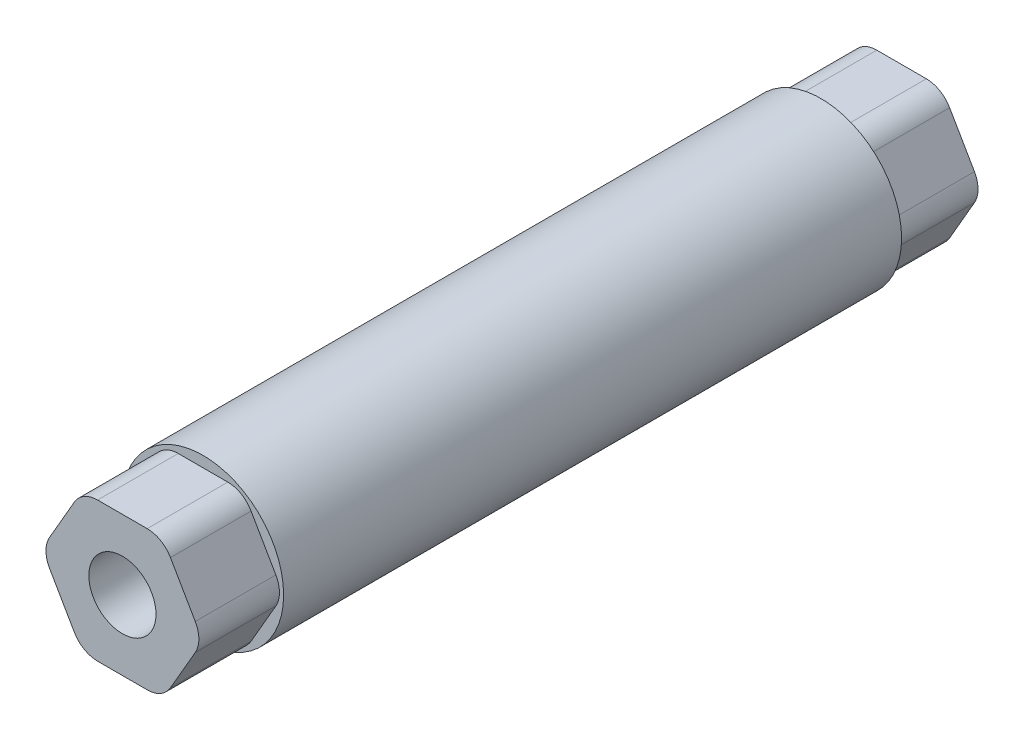
ISO-10303-21;
HEADER;
FILE_DESCRIPTION(('STEP AP214'),'2;1');
FILE_NAME('part.step','',(''),(''),'','','');
FILE_SCHEMA(('AUTOMOTIVE_DESIGN { 1 0 10303 214 1 1 1 1 }'));
ENDSEC;
DATA;
#1=APPLICATION_CONTEXT('core data for automotive mechanical design processes');
#2=APPLICATION_PROTOCOL_DEFINITION('international standard','automotive_design',2000,#1);
#3=PRODUCT_CONTEXT('',#1,'mechanical');
#4=PRODUCT('Part','Part','',(#3));
#5=PRODUCT_RELATED_PRODUCT_CATEGORY('part','',(#4));
#6=PRODUCT_DEFINITION_FORMATION('','',#4);
#7=PRODUCT_DEFINITION_CONTEXT('part definition',#1,'design');
#8=PRODUCT_DEFINITION('design','',#6,#7);
#9=PRODUCT_DEFINITION_SHAPE('','',#8);
#10=(LENGTH_UNIT() NAMED_UNIT(*) SI_UNIT(.MILLI.,.METRE.));
#11=(NAMED_UNIT(*) PLANE_ANGLE_UNIT() SI_UNIT($,.RADIAN.));
#12=(NAMED_UNIT(*) SI_UNIT($,.STERADIAN.) SOLID_ANGLE_UNIT());
#13=UNCERTAINTY_MEASURE_WITH_UNIT(LENGTH_MEASURE(1.E-05),#10,'distance_accuracy_value','');
#14=(GEOMETRIC_REPRESENTATION_CONTEXT(3) GLOBAL_UNCERTAINTY_ASSIGNED_CONTEXT((#13)) GLOBAL_UNIT_ASSIGNED_CONTEXT((#10,
#11,#12)) REPRESENTATION_CONTEXT('',''));
#15=CARTESIAN_POINT('',(0.,0.,0.));
#16=DIRECTION('',(0.,0.,1.));
#17=DIRECTION('',(1.,0.,0.));
#18=AXIS2_PLACEMENT_3D('',#15,#16,#17);
#19=CARTESIAN_POINT('',(0.,0.,29.));
#20=DIRECTION('',(0.,0.,-1.));
#21=DIRECTION('',(-1.,0.,0.));
#22=AXIS2_PLACEMENT_3D('',#19,#20,#21);
#23=CYLINDRICAL_SURFACE('',#22,3.);
#24=CARTESIAN_POINT('',(0.,0.,26.));
#25=DIRECTION('',(0.,0.,1.));
#26=DIRECTION('',(1.,0.,0.));
#27=AXIS2_PLACEMENT_3D('',#24,#25,#26);
#28=CIRCLE('',#27,3.);
#29=CARTESIAN_POINT('',(1.50000000000003,-2.5980762113533,26.));
#30=VERTEX_POINT('',#29);
#31=CARTESIAN_POINT('',(3.,0.,26.));
#32=VERTEX_POINT('',#31);
#33=EDGE_CURVE('E333',#30,#32,#28,.T.);
#34=ORIENTED_EDGE('',*,*,#33,.F.);
#35=CARTESIAN_POINT('',(0.,0.,26.));
#36=DIRECTION('',(0.,0.,1.));
#37=DIRECTION('',(1.,0.,0.));
#38=AXIS2_PLACEMENT_3D('',#35,#36,#37);
#39=CIRCLE('',#38,3.);
#40=CARTESIAN_POINT('',(-1.49999999999998,-2.59807621135333,26.));
#41=VERTEX_POINT('',#40);
#42=EDGE_CURVE('E369',#41,#30,#39,.T.);
#43=ORIENTED_EDGE('',*,*,#42,.F.);
#44=CARTESIAN_POINT('',(0.,0.,26.));
#45=DIRECTION('',(0.,0.,1.));
#46=DIRECTION('',(1.,0.,0.));
#47=AXIS2_PLACEMENT_3D('',#44,#45,#46);
#48=CIRCLE('',#47,3.);
#49=CARTESIAN_POINT('',(-3.,0.,26.));
#50=VERTEX_POINT('',#49);
#51=EDGE_CURVE('E340',#50,#41,#48,.T.);
#52=ORIENTED_EDGE('',*,*,#51,.F.);
#53=CARTESIAN_POINT('',(0.,0.,26.));
#54=DIRECTION('',(0.,0.,1.));
#55=DIRECTION('',(1.,0.,0.));
#56=AXIS2_PLACEMENT_3D('',#53,#54,#55);
#57=CIRCLE('',#56,3.);
#58=CARTESIAN_POINT('',(-1.50000000000001,2.59807621135331,26.));
#59=VERTEX_POINT('',#58);
#60=EDGE_CURVE('E354',#59,#50,#57,.T.);
#61=ORIENTED_EDGE('',*,*,#60,.F.);
#62=CARTESIAN_POINT('',(0.,0.,26.));
#63=DIRECTION('',(0.,0.,1.));
#64=DIRECTION('',(1.,0.,0.));
#65=AXIS2_PLACEMENT_3D('',#62,#63,#64);
#66=CIRCLE('',#65,3.);
#67=CARTESIAN_POINT('',(1.49999999999999,2.59807621135332,26.));
#68=VERTEX_POINT('',#67);
#69=EDGE_CURVE('E347',#68,#59,#66,.T.);
#70=ORIENTED_EDGE('',*,*,#69,.F.);
#71=CARTESIAN_POINT('',(0.,0.,26.));
#72=DIRECTION('',(0.,0.,1.));
#73=DIRECTION('',(1.,0.,0.));
#74=AXIS2_PLACEMENT_3D('',#71,#72,#73);
#75=CIRCLE('',#74,3.);
#76=EDGE_CURVE('E361',#32,#68,#75,.T.);
#77=ORIENTED_EDGE('',*,*,#76,.F.);
#78=EDGE_LOOP('',(#34,#43,#52,#61,#70,#77));
#79=FACE_BOUND('',#78,.T.);
#80=CARTESIAN_POINT('',(0.,0.,3.));
#81=DIRECTION('',(0.,0.,1.));
#82=DIRECTION('',(1.,0.,0.));
#83=AXIS2_PLACEMENT_3D('',#80,#81,#82);
#84=CIRCLE('',#83,3.);
#85=CARTESIAN_POINT('',(1.50000000000003,-2.5980762113533,3.));
#86=VERTEX_POINT('',#85);
#87=CARTESIAN_POINT('',(3.,0.,3.));
#88=VERTEX_POINT('',#87);
#89=EDGE_CURVE('E284',#86,#88,#84,.T.);
#90=ORIENTED_EDGE('',*,*,#89,.T.);
#91=CARTESIAN_POINT('',(0.,0.,3.));
#92=DIRECTION('',(0.,0.,1.));
#93=DIRECTION('',(1.,0.,0.));
#94=AXIS2_PLACEMENT_3D('',#91,#92,#93);
#95=CIRCLE('',#94,3.);
#96=CARTESIAN_POINT('',(1.49999999999999,2.59807621135332,3.));
#97=VERTEX_POINT('',#96);
#98=EDGE_CURVE('E315',#88,#97,#95,.T.);
#99=ORIENTED_EDGE('',*,*,#98,.T.);
#100=CARTESIAN_POINT('',(0.,0.,3.));
#101=DIRECTION('',(0.,0.,1.));
#102=DIRECTION('',(1.,0.,0.));
#103=AXIS2_PLACEMENT_3D('',#100,#101,#102);
#104=CIRCLE('',#103,3.);
#105=CARTESIAN_POINT('',(-1.50000000000001,2.59807621135331,3.));
#106=VERTEX_POINT('',#105);
#107=EDGE_CURVE('E300',#97,#106,#104,.T.);
#108=ORIENTED_EDGE('',*,*,#107,.T.);
#109=CARTESIAN_POINT('',(0.,0.,3.));
#110=DIRECTION('',(0.,0.,1.));
#111=DIRECTION('',(1.,0.,0.));
#112=AXIS2_PLACEMENT_3D('',#109,#110,#111);
#113=CIRCLE('',#112,3.);
#114=CARTESIAN_POINT('',(-3.,0.,3.));
#115=VERTEX_POINT('',#114);
#116=EDGE_CURVE('E308',#106,#115,#113,.T.);
#117=ORIENTED_EDGE('',*,*,#116,.T.);
#118=CARTESIAN_POINT('',(0.,0.,3.));
#119=DIRECTION('',(0.,0.,1.));
#120=DIRECTION('',(1.,0.,0.));
#121=AXIS2_PLACEMENT_3D('',#118,#119,#120);
#122=CIRCLE('',#121,3.);
#123=CARTESIAN_POINT('',(-1.49999999999998,-2.59807621135333,3.));
#124=VERTEX_POINT('',#123);
#125=EDGE_CURVE('E292',#115,#124,#122,.T.);
#126=ORIENTED_EDGE('',*,*,#125,.T.);
#127=CARTESIAN_POINT('',(0.,0.,3.));
#128=DIRECTION('',(0.,0.,1.));
#129=DIRECTION('',(1.,0.,0.));
#130=AXIS2_PLACEMENT_3D('',#127,#128,#129);
#131=CIRCLE('',#130,3.);
#132=EDGE_CURVE('E324',#124,#86,#131,.T.);
#133=ORIENTED_EDGE('',*,*,#132,.T.);
#134=EDGE_LOOP('',(#90,#99,#108,#117,#126,#133));
#135=FACE_BOUND('',#134,.T.);
#136=ADVANCED_FACE('F57',(#79,#135),#23,.T.);
#137=CARTESIAN_POINT('',(0.,0.,29.));
#138=DIRECTION('',(0.,0.,1.));
#139=DIRECTION('',(1.,0.,0.));
#140=AXIS2_PLACEMENT_3D('',#137,#138,#139);
#141=PLANE('',#140);
#142=CARTESIAN_POINT('',(0.,0.,29.));
#143=DIRECTION('',(0.,0.,1.));
#144=DIRECTION('',(1.,0.,0.));
#145=AXIS2_PLACEMENT_3D('',#142,#143,#144);
#146=CIRCLE('',#145,1.25);
#147=CARTESIAN_POINT('',(1.25,0.,29.));
#148=VERTEX_POINT('',#147);
#149=EDGE_CURVE('E269',#148,#148,#146,.T.);
#150=ORIENTED_EDGE('',*,*,#149,.F.);
#151=EDGE_LOOP('',(#150));
#152=FACE_BOUND('',#151,.T.);
#153=DIRECTION('',(0.500000000000007,-0.866025403784435,0.));
#154=VECTOR('',#153,1.);
#155=CARTESIAN_POINT('',(-2.24999999999999,-1.29903810567668,29.));
#156=LINE('',#155,#154);
#157=CARTESIAN_POINT('',(-2.71132486540518,-0.500000000000019,29.));
#158=VERTEX_POINT('',#157);
#159=CARTESIAN_POINT('',(-1.78867513459479,-2.09807621135333,29.));
#160=VERTEX_POINT('',#159);
#161=EDGE_CURVE('E335',#158,#160,#156,.T.);
#162=ORIENTED_EDGE('',*,*,#161,.T.);
#163=CARTESIAN_POINT('',(-0.922649730810359,-1.59807621135332,29.));
#164=DIRECTION('',(0.,0.,1.));
#165=DIRECTION('',(1.,0.,0.));
#166=AXIS2_PLACEMENT_3D('',#163,#164,#165);
#167=CIRCLE('',#166,1.);
#168=CARTESIAN_POINT('',(-0.922649730810349,-2.59807621135332,29.));
#169=VERTEX_POINT('',#168);
#170=EDGE_CURVE('E431',#160,#169,#167,.T.);
#171=ORIENTED_EDGE('',*,*,#170,.T.);
#172=DIRECTION('',(1.,0.,0.));
#173=VECTOR('',#172,1.);
#174=CARTESIAN_POINT('',(0.,-2.59807621135331,29.));
#175=LINE('',#174,#173);
#176=CARTESIAN_POINT('',(0.922649730810408,-2.5980762113533,29.));
#177=VERTEX_POINT('',#176);
#178=EDGE_CURVE('E349',#169,#177,#175,.T.);
#179=ORIENTED_EDGE('',*,*,#178,.T.);
#180=CARTESIAN_POINT('',(0.922649730810398,-1.5980762113533,29.));
#181=DIRECTION('',(0.,0.,1.));
#182=DIRECTION('',(1.,0.,0.));
#183=AXIS2_PLACEMENT_3D('',#180,#181,#182);
#184=CIRCLE('',#183,1.);
#185=CARTESIAN_POINT('',(1.78867513459484,-2.0980762113533,29.));
#186=VERTEX_POINT('',#185);
#187=EDGE_CURVE('E421',#177,#186,#184,.T.);
#188=ORIENTED_EDGE('',*,*,#187,.T.);
#189=DIRECTION('',(0.499999999999995,0.866025403784442,0.));
#190=VECTOR('',#189,1.);
#191=CARTESIAN_POINT('',(2.25000000000002,-1.29903810567665,29.));
#192=LINE('',#191,#190);
#193=CARTESIAN_POINT('',(2.71132486540519,-0.499999999999999,29.));
#194=VERTEX_POINT('',#193);
#195=EDGE_CURVE('E312',#186,#194,#192,.T.);
#196=ORIENTED_EDGE('',*,*,#195,.T.);
#197=CARTESIAN_POINT('',(1.84529946162075,0.,29.));
#198=DIRECTION('',(0.,0.,1.));
#199=DIRECTION('',(1.,0.,0.));
#200=AXIS2_PLACEMENT_3D('',#197,#198,#199);
#201=CIRCLE('',#200,1.);
#202=CARTESIAN_POINT('',(2.71132486540519,0.499999999999997,29.));
#203=VERTEX_POINT('',#202);
#204=EDGE_CURVE('E423',#194,#203,#201,.T.);
#205=ORIENTED_EDGE('',*,*,#204,.T.);
#206=DIRECTION('',(-0.500000000000001,0.866025403784438,0.));
#207=VECTOR('',#206,1.);
#208=CARTESIAN_POINT('',(2.25,1.29903810567666,29.));
#209=LINE('',#208,#207);
#210=CARTESIAN_POINT('',(1.78867513459481,2.09807621135332,29.));
#211=VERTEX_POINT('',#210);
#212=EDGE_CURVE('E364',#203,#211,#209,.T.);
#213=ORIENTED_EDGE('',*,*,#212,.T.);
#214=CARTESIAN_POINT('',(0.92264973081037,1.59807621135332,29.));
#215=DIRECTION('',(0.,0.,1.));
#216=DIRECTION('',(1.,0.,0.));
#217=AXIS2_PLACEMENT_3D('',#214,#215,#216);
#218=CIRCLE('',#217,1.);
#219=CARTESIAN_POINT('',(0.922649730810367,2.59807621135332,29.));
#220=VERTEX_POINT('',#219);
#221=EDGE_CURVE('E425',#211,#220,#218,.T.);
#222=ORIENTED_EDGE('',*,*,#221,.T.);
#223=DIRECTION('',(-1.,0.,0.));
#224=VECTOR('',#223,1.);
#225=CARTESIAN_POINT('',(0.,2.59807621135331,29.));
#226=LINE('',#225,#224);
#227=CARTESIAN_POINT('',(-0.922649730810385,2.59807621135331,29.));
#228=VERTEX_POINT('',#227);
#229=EDGE_CURVE('E342',#220,#228,#226,.T.);
#230=ORIENTED_EDGE('',*,*,#229,.T.);
#231=CARTESIAN_POINT('',(-0.922649730810382,1.59807621135331,29.));
#232=DIRECTION('',(0.,0.,1.));
#233=DIRECTION('',(1.,0.,0.));
#234=AXIS2_PLACEMENT_3D('',#231,#232,#233);
#235=CIRCLE('',#234,1.);
#236=CARTESIAN_POINT('',(-1.78867513459482,2.09807621135331,29.));
#237=VERTEX_POINT('',#236);
#238=EDGE_CURVE('E427',#228,#237,#235,.T.);
#239=ORIENTED_EDGE('',*,*,#238,.T.);
#240=DIRECTION('',(-0.499999999999995,-0.866025403784442,0.));
#241=VECTOR('',#240,1.);
#242=CARTESIAN_POINT('',(-2.25000000000001,1.29903810567664,29.));
#243=LINE('',#242,#241);
#244=CARTESIAN_POINT('',(-2.71132486540519,0.499999999999982,29.));
#245=VERTEX_POINT('',#244);
#246=EDGE_CURVE('E355',#237,#245,#243,.T.);
#247=ORIENTED_EDGE('',*,*,#246,.T.);
#248=CARTESIAN_POINT('',(-1.84529946162075,0.,29.));
#249=DIRECTION('',(0.,0.,1.));
#250=DIRECTION('',(1.,0.,0.));
#251=AXIS2_PLACEMENT_3D('',#248,#249,#250);
#252=CIRCLE('',#251,1.);
#253=EDGE_CURVE('E429',#245,#158,#252,.T.);
#254=ORIENTED_EDGE('',*,*,#253,.T.);
#255=EDGE_LOOP('',(#162,#171,#179,#188,#196,#205,#213,#222,#230,#239,#247,#254));
#256=FACE_BOUND('',#255,.T.);
#257=ADVANCED_FACE('F498',(#152,#256),#141,.T.);
#258=CARTESIAN_POINT('',(0.,0.,0.));
#259=DIRECTION('',(0.,0.,1.));
#260=DIRECTION('',(1.,0.,0.));
#261=AXIS2_PLACEMENT_3D('',#258,#259,#260);
#262=PLANE('',#261);
#263=CARTESIAN_POINT('',(0.,0.,0.));
#264=DIRECTION('',(0.,0.,-1.));
#265=DIRECTION('',(-1.,0.,0.));
#266=AXIS2_PLACEMENT_3D('',#263,#264,#265);
#267=CIRCLE('',#266,1.25);
#268=CARTESIAN_POINT('',(-1.25,0.,0.));
#269=VERTEX_POINT('',#268);
#270=EDGE_CURVE('E270',#269,#269,#267,.T.);
#271=ORIENTED_EDGE('',*,*,#270,.F.);
#272=EDGE_LOOP('',(#271));
#273=FACE_BOUND('',#272,.T.);
#274=DIRECTION('',(-1.,0.,0.));
#275=VECTOR('',#274,1.);
#276=CARTESIAN_POINT('',(0.,2.59807621135331,0.));
#277=LINE('',#276,#275);
#278=CARTESIAN_POINT('',(0.922649730810367,2.59807621135332,0.));
#279=VERTEX_POINT('',#278);
#280=CARTESIAN_POINT('',(-0.922649730810385,2.59807621135331,0.));
#281=VERTEX_POINT('',#280);
#282=EDGE_CURVE('E294',#279,#281,#277,.T.);
#283=ORIENTED_EDGE('',*,*,#282,.F.);
#284=CARTESIAN_POINT('',(0.92264973081037,1.59807621135332,0.));
#285=DIRECTION('',(0.,0.,1.));
#286=DIRECTION('',(1.,0.,0.));
#287=AXIS2_PLACEMENT_3D('',#284,#285,#286);
#288=CIRCLE('',#287,1.);
#289=CARTESIAN_POINT('',(1.78867513459481,2.09807621135332,0.));
#290=VERTEX_POINT('',#289);
#291=EDGE_CURVE('E389',#279,#290,#288,.F.);
#292=ORIENTED_EDGE('',*,*,#291,.T.);
#293=DIRECTION('',(-0.500000000000001,0.866025403784438,0.));
#294=VECTOR('',#293,1.);
#295=CARTESIAN_POINT('',(2.25,1.29903810567666,0.));
#296=LINE('',#295,#294);
#297=CARTESIAN_POINT('',(2.71132486540519,0.499999999999997,0.));
#298=VERTEX_POINT('',#297);
#299=EDGE_CURVE('E319',#298,#290,#296,.T.);
#300=ORIENTED_EDGE('',*,*,#299,.F.);
#301=CARTESIAN_POINT('',(1.84529946162075,0.,0.));
#302=DIRECTION('',(0.,0.,1.));
#303=DIRECTION('',(1.,0.,0.));
#304=AXIS2_PLACEMENT_3D('',#301,#302,#303);
#305=CIRCLE('',#304,1.);
#306=CARTESIAN_POINT('',(2.71132486540519,-0.499999999999999,0.));
#307=VERTEX_POINT('',#306);
#308=EDGE_CURVE('E381',#298,#307,#305,.F.);
#309=ORIENTED_EDGE('',*,*,#308,.T.);
#310=DIRECTION('',(0.499999999999995,0.866025403784442,0.));
#311=VECTOR('',#310,1.);
#312=CARTESIAN_POINT('',(2.25000000000002,-1.29903810567665,0.));
#313=LINE('',#312,#311);
#314=CARTESIAN_POINT('',(1.78867513459484,-2.0980762113533,0.));
#315=VERTEX_POINT('',#314);
#316=EDGE_CURVE('E280',#315,#307,#313,.T.);
#317=ORIENTED_EDGE('',*,*,#316,.F.);
#318=CARTESIAN_POINT('',(0.922649730810398,-1.5980762113533,0.));
#319=DIRECTION('',(0.,0.,1.));
#320=DIRECTION('',(1.,0.,0.));
#321=AXIS2_PLACEMENT_3D('',#318,#319,#320);
#322=CIRCLE('',#321,1.);
#323=CARTESIAN_POINT('',(0.922649730810408,-2.5980762113533,0.));
#324=VERTEX_POINT('',#323);
#325=EDGE_CURVE('E379',#315,#324,#322,.F.);
#326=ORIENTED_EDGE('',*,*,#325,.T.);
#327=DIRECTION('',(1.,0.,0.));
#328=VECTOR('',#327,1.);
#329=CARTESIAN_POINT('',(0.,-2.59807621135331,0.));
#330=LINE('',#329,#328);
#331=CARTESIAN_POINT('',(-0.922649730810349,-2.59807621135332,0.));
#332=VERTEX_POINT('',#331);
#333=EDGE_CURVE('E302',#332,#324,#330,.T.);
#334=ORIENTED_EDGE('',*,*,#333,.F.);
#335=CARTESIAN_POINT('',(-0.922649730810359,-1.59807621135332,0.));
#336=DIRECTION('',(0.,0.,1.));
#337=DIRECTION('',(1.,0.,0.));
#338=AXIS2_PLACEMENT_3D('',#335,#336,#337);
#339=CIRCLE('',#338,1.);
#340=CARTESIAN_POINT('',(-1.78867513459479,-2.09807621135333,0.));
#341=VERTEX_POINT('',#340);
#342=EDGE_CURVE('E383',#332,#341,#339,.F.);
#343=ORIENTED_EDGE('',*,*,#342,.T.);
#344=DIRECTION('',(0.500000000000007,-0.866025403784435,0.));
#345=VECTOR('',#344,1.);
#346=CARTESIAN_POINT('',(-2.24999999999999,-1.29903810567668,0.));
#347=LINE('',#346,#345);
#348=CARTESIAN_POINT('',(-2.71132486540518,-0.500000000000019,0.));
#349=VERTEX_POINT('',#348);
#350=EDGE_CURVE('E286',#349,#341,#347,.T.);
#351=ORIENTED_EDGE('',*,*,#350,.F.);
#352=CARTESIAN_POINT('',(-1.84529946162075,0.,0.));
#353=DIRECTION('',(0.,0.,1.));
#354=DIRECTION('',(1.,0.,0.));
#355=AXIS2_PLACEMENT_3D('',#352,#353,#354);
#356=CIRCLE('',#355,1.);
#357=CARTESIAN_POINT('',(-2.71132486540519,0.499999999999983,0.));
#358=VERTEX_POINT('',#357);
#359=EDGE_CURVE('E385',#349,#358,#356,.F.);
#360=ORIENTED_EDGE('',*,*,#359,.T.);
#361=DIRECTION('',(-0.499999999999995,-0.866025403784442,0.));
#362=VECTOR('',#361,1.);
#363=CARTESIAN_POINT('',(-2.25000000000001,1.29903810567664,0.));
#364=LINE('',#363,#362);
#365=CARTESIAN_POINT('',(-1.78867513459482,2.09807621135331,0.));
#366=VERTEX_POINT('',#365);
#367=EDGE_CURVE('E309',#366,#358,#364,.T.);
#368=ORIENTED_EDGE('',*,*,#367,.F.);
#369=CARTESIAN_POINT('',(-0.922649730810382,1.59807621135331,0.));
#370=DIRECTION('',(0.,0.,1.));
#371=DIRECTION('',(1.,0.,0.));
#372=AXIS2_PLACEMENT_3D('',#369,#370,#371);
#373=CIRCLE('',#372,1.);
#374=EDGE_CURVE('E387',#366,#281,#373,.F.);
#375=ORIENTED_EDGE('',*,*,#374,.T.);
#376=EDGE_LOOP('',(#283,#292,#300,#309,#317,#326,#334,#343,#351,#360,#368,#375));
#377=FACE_BOUND('',#376,.T.);
#378=ADVANCED_FACE('F552',(#273,#377),#262,.F.);
#379=CARTESIAN_POINT('',(0.,-2.59807621135331,26.));
#380=DIRECTION('',(0.,-1.,0.));
#381=DIRECTION('',(1.,0.,0.));
#382=AXIS2_PLACEMENT_3D('',#379,#380,#381);
#383=PLANE('',#382);
#384=ORIENTED_EDGE('',*,*,#178,.F.);
#385=DIRECTION('',(0.,0.,1.));
#386=VECTOR('',#385,1.);
#387=CARTESIAN_POINT('',(-0.922649730810349,-2.59807621135332,26.));
#388=LINE('',#387,#386);
#389=CARTESIAN_POINT('',(-0.922649730810349,-2.59807621135332,26.));
#390=VERTEX_POINT('',#389);
#391=EDGE_CURVE('E435',#169,#390,#388,.F.);
#392=ORIENTED_EDGE('',*,*,#391,.T.);
#393=DIRECTION('',(1.,0.,0.));
#394=VECTOR('',#393,1.);
#395=CARTESIAN_POINT('',(0.,-2.59807621135331,26.));
#396=LINE('',#395,#394);
#397=CARTESIAN_POINT('',(0.922649730810408,-2.5980762113533,26.));
#398=VERTEX_POINT('',#397);
#399=EDGE_CURVE('E72',#390,#398,#396,.T.);
#400=ORIENTED_EDGE('',*,*,#399,.T.);
#401=DIRECTION('',(0.,0.,1.));
#402=VECTOR('',#401,1.);
#403=CARTESIAN_POINT('',(0.922649730810408,-2.5980762113533,26.));
#404=LINE('',#403,#402);
#405=EDGE_CURVE('E433',#398,#177,#404,.T.);
#406=ORIENTED_EDGE('',*,*,#405,.T.);
#407=EDGE_LOOP('',(#384,#392,#400,#406));
#408=FACE_BOUND('',#407,.T.);
#409=ADVANCED_FACE('F503',(#408),#383,.T.);
#410=CARTESIAN_POINT('',(0.,0.,26.));
#411=DIRECTION('',(0.,0.,1.));
#412=DIRECTION('',(1.,0.,0.));
#413=AXIS2_PLACEMENT_3D('',#410,#411,#412);
#414=PLANE('',#413);
#415=ORIENTED_EDGE('',*,*,#42,.T.);
#416=ORIENTED_EDGE('',*,*,#33,.T.);
#417=ORIENTED_EDGE('',*,*,#76,.T.);
#418=ORIENTED_EDGE('',*,*,#69,.T.);
#419=ORIENTED_EDGE('',*,*,#60,.T.);
#420=ORIENTED_EDGE('',*,*,#51,.T.);
#421=EDGE_LOOP('',(#415,#416,#417,#418,#419,#420));
#422=FACE_BOUND('',#421,.T.);
#423=ORIENTED_EDGE('',*,*,#399,.F.);
#424=CARTESIAN_POINT('',(-0.922649730810359,-1.59807621135332,26.));
#425=DIRECTION('',(0.,0.,1.));
#426=DIRECTION('',(1.,0.,0.));
#427=AXIS2_PLACEMENT_3D('',#424,#425,#426);
#428=CIRCLE('',#427,1.);
#429=CARTESIAN_POINT('',(-1.78867513459479,-2.09807621135333,26.));
#430=VERTEX_POINT('',#429);
#431=EDGE_CURVE('E474',#390,#430,#428,.F.);
#432=ORIENTED_EDGE('',*,*,#431,.T.);
#433=DIRECTION('',(0.500000000000007,-0.866025403784435,0.));
#434=VECTOR('',#433,1.);
#435=CARTESIAN_POINT('',(-2.24999999999999,-1.29903810567668,26.));
#436=LINE('',#435,#434);
#437=CARTESIAN_POINT('',(-2.71132486540518,-0.500000000000019,26.));
#438=VERTEX_POINT('',#437);
#439=EDGE_CURVE('E338',#438,#430,#436,.T.);
#440=ORIENTED_EDGE('',*,*,#439,.F.);
#441=CARTESIAN_POINT('',(-1.84529946162075,0.,26.));
#442=DIRECTION('',(0.,0.,1.));
#443=DIRECTION('',(1.,0.,0.));
#444=AXIS2_PLACEMENT_3D('',#441,#442,#443);
#445=CIRCLE('',#444,1.);
#446=CARTESIAN_POINT('',(-2.71132486540519,0.499999999999982,26.));
#447=VERTEX_POINT('',#446);
#448=EDGE_CURVE('E477',#438,#447,#445,.F.);
#449=ORIENTED_EDGE('',*,*,#448,.T.);
#450=DIRECTION('',(-0.499999999999995,-0.866025403784442,0.));
#451=VECTOR('',#450,1.);
#452=CARTESIAN_POINT('',(-2.25000000000001,1.29903810567664,26.));
#453=LINE('',#452,#451);
#454=CARTESIAN_POINT('',(-1.78867513459482,2.09807621135331,26.));
#455=VERTEX_POINT('',#454);
#456=EDGE_CURVE('E352',#455,#447,#453,.T.);
#457=ORIENTED_EDGE('',*,*,#456,.F.);
#458=CARTESIAN_POINT('',(-0.922649730810382,1.59807621135331,26.));
#459=DIRECTION('',(0.,0.,1.));
#460=DIRECTION('',(1.,0.,0.));
#461=AXIS2_PLACEMENT_3D('',#458,#459,#460);
#462=CIRCLE('',#461,1.);
#463=CARTESIAN_POINT('',(-0.922649730810385,2.59807621135331,26.));
#464=VERTEX_POINT('',#463);
#465=EDGE_CURVE('E480',#455,#464,#462,.F.);
#466=ORIENTED_EDGE('',*,*,#465,.T.);
#467=DIRECTION('',(-1.,0.,0.));
#468=VECTOR('',#467,1.);
#469=CARTESIAN_POINT('',(0.,2.59807621135331,26.));
#470=LINE('',#469,#468);
#471=CARTESIAN_POINT('',(0.922649730810367,2.59807621135332,26.));
#472=VERTEX_POINT('',#471);
#473=EDGE_CURVE('E345',#472,#464,#470,.T.);
#474=ORIENTED_EDGE('',*,*,#473,.F.);
#475=CARTESIAN_POINT('',(0.92264973081037,1.59807621135332,26.));
#476=DIRECTION('',(0.,0.,1.));
#477=DIRECTION('',(1.,0.,0.));
#478=AXIS2_PLACEMENT_3D('',#475,#476,#477);
#479=CIRCLE('',#478,1.);
#480=CARTESIAN_POINT('',(1.78867513459481,2.09807621135332,26.));
#481=VERTEX_POINT('',#480);
#482=EDGE_CURVE('E483',#472,#481,#479,.F.);
#483=ORIENTED_EDGE('',*,*,#482,.T.);
#484=DIRECTION('',(-0.500000000000001,0.866025403784438,0.));
#485=VECTOR('',#484,1.);
#486=CARTESIAN_POINT('',(2.25,1.29903810567666,26.));
#487=LINE('',#486,#485);
#488=CARTESIAN_POINT('',(2.71132486540519,0.499999999999997,26.));
#489=VERTEX_POINT('',#488);
#490=EDGE_CURVE('E362',#489,#481,#487,.T.);
#491=ORIENTED_EDGE('',*,*,#490,.F.);
#492=CARTESIAN_POINT('',(1.84529946162075,0.,26.));
#493=DIRECTION('',(0.,0.,1.));
#494=DIRECTION('',(1.,0.,0.));
#495=AXIS2_PLACEMENT_3D('',#492,#493,#494);
#496=CIRCLE('',#495,1.);
#497=CARTESIAN_POINT('',(2.71132486540519,-0.499999999999999,26.));
#498=VERTEX_POINT('',#497);
#499=EDGE_CURVE('E65',#489,#498,#496,.F.);
#500=ORIENTED_EDGE('',*,*,#499,.T.);
#501=DIRECTION('',(0.499999999999995,0.866025403784442,0.));
#502=VECTOR('',#501,1.);
#503=CARTESIAN_POINT('',(2.25000000000002,-1.29903810567665,26.));
#504=LINE('',#503,#502);
#505=CARTESIAN_POINT('',(1.78867513459484,-2.0980762113533,26.));
#506=VERTEX_POINT('',#505);
#507=EDGE_CURVE('E79',#506,#498,#504,.T.);
#508=ORIENTED_EDGE('',*,*,#507,.F.);
#509=CARTESIAN_POINT('',(0.922649730810398,-1.5980762113533,26.));
#510=DIRECTION('',(0.,0.,1.));
#511=DIRECTION('',(1.,0.,0.));
#512=AXIS2_PLACEMENT_3D('',#509,#510,#511);
#513=CIRCLE('',#512,1.);
#514=EDGE_CURVE('E12',#506,#398,#513,.F.);
#515=ORIENTED_EDGE('',*,*,#514,.T.);
#516=EDGE_LOOP('',(#423,#432,#440,#449,#457,#466,#474,#483,#491,#500,#508,#515));
#517=FACE_BOUND('',#516,.T.);
#518=ADVANCED_FACE('F489',(#422,#517),#414,.T.);
#519=CARTESIAN_POINT('',(2.25,1.29903810567666,26.));
#520=DIRECTION('',(0.866025403784438,0.500000000000001,0.));
#521=DIRECTION('',(-0.500000000000001,0.866025403784438,0.));
#522=AXIS2_PLACEMENT_3D('',#519,#520,#521);
#523=PLANE('',#522);
#524=ORIENTED_EDGE('',*,*,#490,.T.);
#525=DIRECTION('',(0.,0.,1.));
#526=VECTOR('',#525,1.);
#527=CARTESIAN_POINT('',(1.78867513459481,2.09807621135332,26.));
#528=LINE('',#527,#526);
#529=EDGE_CURVE('E449',#481,#211,#528,.T.);
#530=ORIENTED_EDGE('',*,*,#529,.T.);
#531=ORIENTED_EDGE('',*,*,#212,.F.);
#532=DIRECTION('',(0.,0.,1.));
#533=VECTOR('',#532,1.);
#534=CARTESIAN_POINT('',(2.71132486540519,0.499999999999997,26.));
#535=LINE('',#534,#533);
#536=EDGE_CURVE('E447',#203,#489,#535,.F.);
#537=ORIENTED_EDGE('',*,*,#536,.T.);
#538=EDGE_LOOP('',(#524,#530,#531,#537));
#539=FACE_BOUND('',#538,.T.);
#540=ADVANCED_FACE('F536',(#539),#523,.T.);
#541=CARTESIAN_POINT('',(-2.25000000000001,1.29903810567664,26.));
#542=DIRECTION('',(-0.866025403784441,0.499999999999995,0.));
#543=DIRECTION('',(-0.499999999999995,-0.866025403784442,0.));
#544=AXIS2_PLACEMENT_3D('',#541,#542,#543);
#545=PLANE('',#544);
#546=ORIENTED_EDGE('',*,*,#456,.T.);
#547=DIRECTION('',(0.,0.,1.));
#548=VECTOR('',#547,1.);
#549=CARTESIAN_POINT('',(-2.71132486540519,0.499999999999982,26.));
#550=LINE('',#549,#548);
#551=EDGE_CURVE('E439',#447,#245,#550,.T.);
#552=ORIENTED_EDGE('',*,*,#551,.T.);
#553=ORIENTED_EDGE('',*,*,#246,.F.);
#554=DIRECTION('',(0.,0.,1.));
#555=VECTOR('',#554,1.);
#556=CARTESIAN_POINT('',(-1.78867513459482,2.09807621135331,26.));
#557=LINE('',#556,#555);
#558=EDGE_CURVE('E437',#237,#455,#557,.F.);
#559=ORIENTED_EDGE('',*,*,#558,.T.);
#560=EDGE_LOOP('',(#546,#552,#553,#559));
#561=FACE_BOUND('',#560,.T.);
#562=ADVANCED_FACE('F519',(#561),#545,.T.);
#563=CARTESIAN_POINT('',(0.,2.59807621135331,26.));
#564=DIRECTION('',(0.,1.,0.));
#565=DIRECTION('',(-1.,0.,0.));
#566=AXIS2_PLACEMENT_3D('',#563,#564,#565);
#567=PLANE('',#566);
#568=ORIENTED_EDGE('',*,*,#473,.T.);
#569=DIRECTION('',(0.,0.,1.));
#570=VECTOR('',#569,1.);
#571=CARTESIAN_POINT('',(-0.922649730810385,2.59807621135331,26.));
#572=LINE('',#571,#570);
#573=EDGE_CURVE('E444',#464,#228,#572,.T.);
#574=ORIENTED_EDGE('',*,*,#573,.T.);
#575=ORIENTED_EDGE('',*,*,#229,.F.);
#576=DIRECTION('',(0.,0.,1.));
#577=VECTOR('',#576,1.);
#578=CARTESIAN_POINT('',(0.922649730810367,2.59807621135332,26.));
#579=LINE('',#578,#577);
#580=EDGE_CURVE('E442',#220,#472,#579,.F.);
#581=ORIENTED_EDGE('',*,*,#580,.T.);
#582=EDGE_LOOP('',(#568,#574,#575,#581));
#583=FACE_BOUND('',#582,.T.);
#584=ADVANCED_FACE('F528',(#583),#567,.T.);
#585=CARTESIAN_POINT('',(-2.24999999999999,-1.29903810567668,26.));
#586=DIRECTION('',(-0.866025403784435,-0.500000000000007,0.));
#587=DIRECTION('',(0.500000000000007,-0.866025403784435,0.));
#588=AXIS2_PLACEMENT_3D('',#585,#586,#587);
#589=PLANE('',#588);
#590=ORIENTED_EDGE('',*,*,#439,.T.);
#591=DIRECTION('',(0.,0.,1.));
#592=VECTOR('',#591,1.);
#593=CARTESIAN_POINT('',(-1.78867513459479,-2.09807621135333,26.));
#594=LINE('',#593,#592);
#595=EDGE_CURVE('E418',#430,#160,#594,.T.);
#596=ORIENTED_EDGE('',*,*,#595,.T.);
#597=ORIENTED_EDGE('',*,*,#161,.F.);
#598=DIRECTION('',(0.,0.,1.));
#599=VECTOR('',#598,1.);
#600=CARTESIAN_POINT('',(-2.71132486540518,-0.500000000000019,26.));
#601=LINE('',#600,#599);
#602=EDGE_CURVE('E416',#158,#438,#601,.F.);
#603=ORIENTED_EDGE('',*,*,#602,.T.);
#604=EDGE_LOOP('',(#590,#596,#597,#603));
#605=FACE_BOUND('',#604,.T.);
#606=ADVANCED_FACE('F746',(#605),#589,.T.);
#607=CARTESIAN_POINT('',(2.25000000000002,-1.29903810567665,26.));
#608=DIRECTION('',(0.866025403784441,-0.499999999999995,0.));
#609=DIRECTION('',(0.499999999999995,0.866025403784442,0.));
#610=AXIS2_PLACEMENT_3D('',#607,#608,#609);
#611=PLANE('',#610);
#612=ORIENTED_EDGE('',*,*,#507,.T.);
#613=DIRECTION('',(0.,0.,1.));
#614=VECTOR('',#613,1.);
#615=CARTESIAN_POINT('',(2.71132486540519,-0.499999999999999,26.));
#616=LINE('',#615,#614);
#617=EDGE_CURVE('E454',#498,#194,#616,.T.);
#618=ORIENTED_EDGE('',*,*,#617,.T.);
#619=ORIENTED_EDGE('',*,*,#195,.F.);
#620=DIRECTION('',(0.,0.,1.));
#621=VECTOR('',#620,1.);
#622=CARTESIAN_POINT('',(1.78867513459484,-2.0980762113533,26.));
#623=LINE('',#622,#621);
#624=EDGE_CURVE('E452',#186,#506,#623,.F.);
#625=ORIENTED_EDGE('',*,*,#624,.T.);
#626=EDGE_LOOP('',(#612,#618,#619,#625));
#627=FACE_BOUND('',#626,.T.);
#628=ADVANCED_FACE('F495',(#627),#611,.T.);
#629=CARTESIAN_POINT('',(0.,-2.59807621135331,3.));
#630=DIRECTION('',(0.,1.,0.));
#631=DIRECTION('',(-1.,0.,0.));
#632=AXIS2_PLACEMENT_3D('',#629,#630,#631);
#633=PLANE('',#632);
#634=DIRECTION('',(1.,0.,0.));
#635=VECTOR('',#634,1.);
#636=CARTESIAN_POINT('',(0.,-2.59807621135331,3.));
#637=LINE('',#636,#635);
#638=CARTESIAN_POINT('',(-0.922649730810349,-2.59807621135332,3.));
#639=VERTEX_POINT('',#638);
#640=CARTESIAN_POINT('',(0.922649730810408,-2.5980762113533,3.));
#641=VERTEX_POINT('',#640);
#642=EDGE_CURVE('E325',#639,#641,#637,.T.);
#643=ORIENTED_EDGE('',*,*,#642,.F.);
#644=DIRECTION('',(0.,0.,-1.));
#645=VECTOR('',#644,1.);
#646=CARTESIAN_POINT('',(-0.922649730810349,-2.59807621135332,3.));
#647=LINE('',#646,#645);
#648=EDGE_CURVE('E408',#639,#332,#647,.T.);
#649=ORIENTED_EDGE('',*,*,#648,.T.);
#650=ORIENTED_EDGE('',*,*,#333,.T.);
#651=DIRECTION('',(0.,0.,-1.));
#652=VECTOR('',#651,1.);
#653=CARTESIAN_POINT('',(0.922649730810408,-2.5980762113533,3.));
#654=LINE('',#653,#652);
#655=EDGE_CURVE('E406',#324,#641,#654,.F.);
#656=ORIENTED_EDGE('',*,*,#655,.T.);
#657=EDGE_LOOP('',(#643,#649,#650,#656));
#658=FACE_BOUND('',#657,.T.);
#659=ADVANCED_FACE('F726',(#658),#633,.F.);
#660=CARTESIAN_POINT('',(2.25,1.29903810567666,3.));
#661=DIRECTION('',(-0.866025403784438,-0.500000000000001,0.));
#662=DIRECTION('',(0.500000000000001,-0.866025403784438,0.));
#663=AXIS2_PLACEMENT_3D('',#660,#661,#662);
#664=PLANE('',#663);
#665=ORIENTED_EDGE('',*,*,#299,.T.);
#666=DIRECTION('',(0.,0.,-1.));
#667=VECTOR('',#666,1.);
#668=CARTESIAN_POINT('',(1.78867513459481,2.09807621135332,3.));
#669=LINE('',#668,#667);
#670=CARTESIAN_POINT('',(1.78867513459481,2.09807621135332,3.));
#671=VERTEX_POINT('',#670);
#672=EDGE_CURVE('E394',#290,#671,#669,.F.);
#673=ORIENTED_EDGE('',*,*,#672,.T.);
#674=DIRECTION('',(-0.500000000000001,0.866025403784438,0.));
#675=VECTOR('',#674,1.);
#676=CARTESIAN_POINT('',(2.25,1.29903810567666,3.));
#677=LINE('',#676,#675);
#678=CARTESIAN_POINT('',(2.71132486540519,0.499999999999997,3.));
#679=VERTEX_POINT('',#678);
#680=EDGE_CURVE('E316',#679,#671,#677,.T.);
#681=ORIENTED_EDGE('',*,*,#680,.F.);
#682=DIRECTION('',(0.,0.,-1.));
#683=VECTOR('',#682,1.);
#684=CARTESIAN_POINT('',(2.71132486540519,0.499999999999997,3.));
#685=LINE('',#684,#683);
#686=EDGE_CURVE('E391',#679,#298,#685,.T.);
#687=ORIENTED_EDGE('',*,*,#686,.T.);
#688=EDGE_LOOP('',(#665,#673,#681,#687));
#689=FACE_BOUND('',#688,.T.);
#690=ADVANCED_FACE('F716',(#689),#664,.F.);
#691=CARTESIAN_POINT('',(-2.25000000000001,1.29903810567664,3.));
#692=DIRECTION('',(0.866025403784441,-0.499999999999995,0.));
#693=DIRECTION('',(0.499999999999995,0.866025403784442,0.));
#694=AXIS2_PLACEMENT_3D('',#691,#692,#693);
#695=PLANE('',#694);
#696=DIRECTION('',(-0.499999999999995,-0.866025403784442,0.));
#697=VECTOR('',#696,1.);
#698=CARTESIAN_POINT('',(-2.25000000000001,1.29903810567664,3.));
#699=LINE('',#698,#697);
#700=CARTESIAN_POINT('',(-1.78867513459482,2.09807621135331,3.));
#701=VERTEX_POINT('',#700);
#702=CARTESIAN_POINT('',(-2.71132486540519,0.499999999999983,3.));
#703=VERTEX_POINT('',#702);
#704=EDGE_CURVE('E305',#701,#703,#699,.T.);
#705=ORIENTED_EDGE('',*,*,#704,.F.);
#706=DIRECTION('',(0.,0.,-1.));
#707=VECTOR('',#706,1.);
#708=CARTESIAN_POINT('',(-1.78867513459482,2.09807621135331,3.));
#709=LINE('',#708,#707);
#710=EDGE_CURVE('E398',#701,#366,#709,.T.);
#711=ORIENTED_EDGE('',*,*,#710,.T.);
#712=ORIENTED_EDGE('',*,*,#367,.T.);
#713=DIRECTION('',(0.,0.,-1.));
#714=VECTOR('',#713,1.);
#715=CARTESIAN_POINT('',(-2.71132486540519,0.499999999999983,3.));
#716=LINE('',#715,#714);
#717=EDGE_CURVE('E396',#358,#703,#716,.F.);
#718=ORIENTED_EDGE('',*,*,#717,.T.);
#719=EDGE_LOOP('',(#705,#711,#712,#718));
#720=FACE_BOUND('',#719,.T.);
#721=ADVANCED_FACE('F706',(#720),#695,.F.);
#722=CARTESIAN_POINT('',(0.,2.59807621135331,3.));
#723=DIRECTION('',(0.,-1.,0.));
#724=DIRECTION('',(1.,0.,0.));
#725=AXIS2_PLACEMENT_3D('',#722,#723,#724);
#726=PLANE('',#725);
#727=DIRECTION('',(-1.,0.,0.));
#728=VECTOR('',#727,1.);
#729=CARTESIAN_POINT('',(0.,2.59807621135331,3.));
#730=LINE('',#729,#728);
#731=CARTESIAN_POINT('',(0.922649730810367,2.59807621135332,3.));
#732=VERTEX_POINT('',#731);
#733=CARTESIAN_POINT('',(-0.922649730810385,2.59807621135331,3.));
#734=VERTEX_POINT('',#733);
#735=EDGE_CURVE('E297',#732,#734,#730,.T.);
#736=ORIENTED_EDGE('',*,*,#735,.F.);
#737=DIRECTION('',(0.,0.,-1.));
#738=VECTOR('',#737,1.);
#739=CARTESIAN_POINT('',(0.922649730810367,2.59807621135332,3.));
#740=LINE('',#739,#738);
#741=EDGE_CURVE('E376',#732,#279,#740,.T.);
#742=ORIENTED_EDGE('',*,*,#741,.T.);
#743=ORIENTED_EDGE('',*,*,#282,.T.);
#744=DIRECTION('',(0.,0.,-1.));
#745=VECTOR('',#744,1.);
#746=CARTESIAN_POINT('',(-0.922649730810385,2.59807621135331,3.));
#747=LINE('',#746,#745);
#748=EDGE_CURVE('E358',#281,#734,#747,.F.);
#749=ORIENTED_EDGE('',*,*,#748,.T.);
#750=EDGE_LOOP('',(#736,#742,#743,#749));
#751=FACE_BOUND('',#750,.T.);
#752=ADVANCED_FACE('F696',(#751),#726,.F.);
#753=CARTESIAN_POINT('',(-2.24999999999999,-1.29903810567668,3.));
#754=DIRECTION('',(0.866025403784435,0.500000000000007,0.));
#755=DIRECTION('',(-0.500000000000007,0.866025403784435,0.));
#756=AXIS2_PLACEMENT_3D('',#753,#754,#755);
#757=PLANE('',#756);
#758=DIRECTION('',(0.500000000000007,-0.866025403784435,0.));
#759=VECTOR('',#758,1.);
#760=CARTESIAN_POINT('',(-2.24999999999999,-1.29903810567668,3.));
#761=LINE('',#760,#759);
#762=CARTESIAN_POINT('',(-2.71132486540518,-0.500000000000019,3.));
#763=VERTEX_POINT('',#762);
#764=CARTESIAN_POINT('',(-1.78867513459479,-2.09807621135333,3.));
#765=VERTEX_POINT('',#764);
#766=EDGE_CURVE('E289',#763,#765,#761,.T.);
#767=ORIENTED_EDGE('',*,*,#766,.F.);
#768=DIRECTION('',(0.,0.,-1.));
#769=VECTOR('',#768,1.);
#770=CARTESIAN_POINT('',(-2.71132486540518,-0.500000000000019,3.));
#771=LINE('',#770,#769);
#772=EDGE_CURVE('E403',#763,#349,#771,.T.);
#773=ORIENTED_EDGE('',*,*,#772,.T.);
#774=ORIENTED_EDGE('',*,*,#350,.T.);
#775=DIRECTION('',(0.,0.,-1.));
#776=VECTOR('',#775,1.);
#777=CARTESIAN_POINT('',(-1.78867513459479,-2.09807621135333,3.));
#778=LINE('',#777,#776);
#779=EDGE_CURVE('E401',#341,#765,#778,.F.);
#780=ORIENTED_EDGE('',*,*,#779,.T.);
#781=EDGE_LOOP('',(#767,#773,#774,#780));
#782=FACE_BOUND('',#781,.T.);
#783=ADVANCED_FACE('F685',(#782),#757,.F.);
#784=CARTESIAN_POINT('',(2.25000000000002,-1.29903810567665,3.));
#785=DIRECTION('',(-0.866025403784441,0.499999999999995,0.));
#786=DIRECTION('',(-0.499999999999995,-0.866025403784442,0.));
#787=AXIS2_PLACEMENT_3D('',#784,#785,#786);
#788=PLANE('',#787);
#789=ORIENTED_EDGE('',*,*,#316,.T.);
#790=DIRECTION('',(0.,0.,-1.));
#791=VECTOR('',#790,1.);
#792=CARTESIAN_POINT('',(2.71132486540519,-0.499999999999999,3.));
#793=LINE('',#792,#791);
#794=CARTESIAN_POINT('',(2.71132486540519,-0.499999999999999,3.));
#795=VERTEX_POINT('',#794);
#796=EDGE_CURVE('E414',#307,#795,#793,.F.);
#797=ORIENTED_EDGE('',*,*,#796,.T.);
#798=DIRECTION('',(0.499999999999995,0.866025403784442,0.));
#799=VECTOR('',#798,1.);
#800=CARTESIAN_POINT('',(2.25000000000002,-1.29903810567665,3.));
#801=LINE('',#800,#799);
#802=CARTESIAN_POINT('',(1.78867513459484,-2.0980762113533,3.));
#803=VERTEX_POINT('',#802);
#804=EDGE_CURVE('E281',#803,#795,#801,.T.);
#805=ORIENTED_EDGE('',*,*,#804,.F.);
#806=DIRECTION('',(0.,0.,-1.));
#807=VECTOR('',#806,1.);
#808=CARTESIAN_POINT('',(1.78867513459484,-2.0980762113533,3.));
#809=LINE('',#808,#807);
#810=EDGE_CURVE('E411',#803,#315,#809,.T.);
#811=ORIENTED_EDGE('',*,*,#810,.T.);
#812=EDGE_LOOP('',(#789,#797,#805,#811));
#813=FACE_BOUND('',#812,.T.);
#814=ADVANCED_FACE('F672',(#813),#788,.F.);
#815=CARTESIAN_POINT('',(0.,0.,3.));
#816=DIRECTION('',(0.,0.,-1.));
#817=DIRECTION('',(1.,0.,0.));
#818=AXIS2_PLACEMENT_3D('',#815,#816,#817);
#819=PLANE('',#818);
#820=ORIENTED_EDGE('',*,*,#89,.F.);
#821=ORIENTED_EDGE('',*,*,#132,.F.);
#822=ORIENTED_EDGE('',*,*,#125,.F.);
#823=ORIENTED_EDGE('',*,*,#116,.F.);
#824=ORIENTED_EDGE('',*,*,#107,.F.);
#825=ORIENTED_EDGE('',*,*,#98,.F.);
#826=EDGE_LOOP('',(#820,#821,#822,#823,#824,#825));
#827=FACE_BOUND('',#826,.T.);
#828=CARTESIAN_POINT('',(0.922649730810398,-1.5980762113533,3.));
#829=DIRECTION('',(0.,0.,-1.));
#830=DIRECTION('',(-1.,0.,0.));
#831=AXIS2_PLACEMENT_3D('',#828,#829,#830);
#832=CIRCLE('',#831,1.);
#833=EDGE_CURVE('E471',#641,#803,#832,.F.);
#834=ORIENTED_EDGE('',*,*,#833,.T.);
#835=ORIENTED_EDGE('',*,*,#804,.T.);
#836=CARTESIAN_POINT('',(1.84529946162075,0.,3.));
#837=DIRECTION('',(0.,0.,-1.));
#838=DIRECTION('',(-1.,0.,0.));
#839=AXIS2_PLACEMENT_3D('',#836,#837,#838);
#840=CIRCLE('',#839,1.);
#841=EDGE_CURVE('E468',#795,#679,#840,.F.);
#842=ORIENTED_EDGE('',*,*,#841,.T.);
#843=ORIENTED_EDGE('',*,*,#680,.T.);
#844=CARTESIAN_POINT('',(0.92264973081037,1.59807621135332,3.));
#845=DIRECTION('',(0.,0.,-1.));
#846=DIRECTION('',(-1.,0.,0.));
#847=AXIS2_PLACEMENT_3D('',#844,#845,#846);
#848=CIRCLE('',#847,1.);
#849=EDGE_CURVE('E456',#671,#732,#848,.F.);
#850=ORIENTED_EDGE('',*,*,#849,.T.);
#851=ORIENTED_EDGE('',*,*,#735,.T.);
#852=CARTESIAN_POINT('',(-0.922649730810382,1.59807621135331,3.));
#853=DIRECTION('',(0.,0.,-1.));
#854=DIRECTION('',(-1.,0.,0.));
#855=AXIS2_PLACEMENT_3D('',#852,#853,#854);
#856=CIRCLE('',#855,1.);
#857=EDGE_CURVE('E459',#734,#701,#856,.F.);
#858=ORIENTED_EDGE('',*,*,#857,.T.);
#859=ORIENTED_EDGE('',*,*,#704,.T.);
#860=CARTESIAN_POINT('',(-1.84529946162075,0.,3.));
#861=DIRECTION('',(0.,0.,-1.));
#862=DIRECTION('',(-1.,0.,0.));
#863=AXIS2_PLACEMENT_3D('',#860,#861,#862);
#864=CIRCLE('',#863,1.);
#865=EDGE_CURVE('E462',#703,#763,#864,.F.);
#866=ORIENTED_EDGE('',*,*,#865,.T.);
#867=ORIENTED_EDGE('',*,*,#766,.T.);
#868=CARTESIAN_POINT('',(-0.922649730810359,-1.59807621135332,3.));
#869=DIRECTION('',(0.,0.,-1.));
#870=DIRECTION('',(-1.,0.,0.));
#871=AXIS2_PLACEMENT_3D('',#868,#869,#870);
#872=CIRCLE('',#871,1.);
#873=EDGE_CURVE('E465',#765,#639,#872,.F.);
#874=ORIENTED_EDGE('',*,*,#873,.T.);
#875=ORIENTED_EDGE('',*,*,#642,.T.);
#876=EDGE_LOOP('',(#834,#835,#842,#843,#850,#851,#858,#859,#866,#867,#874,#875));
#877=FACE_BOUND('',#876,.T.);
#878=ADVANCED_FACE('F666',(#827,#877),#819,.T.);
#879=CARTESIAN_POINT('',(0.,0.,24.));
#880=DIRECTION('',(0.,0.,1.));
#881=DIRECTION('',(1.,0.,0.));
#882=AXIS2_PLACEMENT_3D('',#879,#880,#881);
#883=CONICAL_SURFACE('',#882,1.25,1.02974425867665);
#884=CARTESIAN_POINT('',(0.,0.,23.2489242262155));
#885=VERTEX_POINT('',#884);
#886=VERTEX_LOOP('',#885);
#887=FACE_BOUND('',#886,.T.);
#888=CARTESIAN_POINT('',(0.,0.,24.));
#889=DIRECTION('',(0.,0.,1.));
#890=DIRECTION('',(1.,0.,0.));
#891=AXIS2_PLACEMENT_3D('',#888,#889,#890);
#892=CIRCLE('',#891,1.25);
#893=CARTESIAN_POINT('',(1.25,0.,24.));
#894=VERTEX_POINT('',#893);
#895=EDGE_CURVE('E273',#894,#894,#892,.T.);
#896=ORIENTED_EDGE('',*,*,#895,.T.);
#897=EDGE_LOOP('',(#896));
#898=FACE_BOUND('',#897,.T.);
#899=ADVANCED_FACE('F671',(#887,#898),#883,.F.);
#900=CARTESIAN_POINT('',(0.,0.,29.));
#901=DIRECTION('',(0.,0.,1.));
#902=DIRECTION('',(1.,0.,0.));
#903=AXIS2_PLACEMENT_3D('',#900,#901,#902);
#904=CYLINDRICAL_SURFACE('',#903,1.25);
#905=ORIENTED_EDGE('',*,*,#895,.F.);
#906=EDGE_LOOP('',(#905));
#907=FACE_BOUND('',#906,.T.);
#908=ORIENTED_EDGE('',*,*,#149,.T.);
#909=EDGE_LOOP('',(#908));
#910=FACE_BOUND('',#909,.T.);
#911=ADVANCED_FACE('F263',(#907,#910),#904,.F.);
#912=CARTESIAN_POINT('',(0.,0.,5.));
#913=DIRECTION('',(0.,0.,-1.));
#914=DIRECTION('',(-1.,0.,0.));
#915=AXIS2_PLACEMENT_3D('',#912,#913,#914);
#916=CONICAL_SURFACE('',#915,1.25,1.02974425867665);
#917=CARTESIAN_POINT('',(0.,0.,5.75107577378445));
#918=VERTEX_POINT('',#917);
#919=VERTEX_LOOP('',#918);
#920=FACE_BOUND('',#919,.T.);
#921=CARTESIAN_POINT('',(0.,0.,5.));
#922=DIRECTION('',(0.,0.,-1.));
#923=DIRECTION('',(-1.,0.,0.));
#924=AXIS2_PLACEMENT_3D('',#921,#922,#923);
#925=CIRCLE('',#924,1.25);
#926=CARTESIAN_POINT('',(-1.25,0.,5.));
#927=VERTEX_POINT('',#926);
#928=EDGE_CURVE('E267',#927,#927,#925,.T.);
#929=ORIENTED_EDGE('',*,*,#928,.T.);
#930=EDGE_LOOP('',(#929));
#931=FACE_BOUND('',#930,.T.);
#932=ADVANCED_FACE('F259',(#920,#931),#916,.F.);
#933=CARTESIAN_POINT('',(0.,0.,0.));
#934=DIRECTION('',(0.,0.,-1.));
#935=DIRECTION('',(-1.,0.,0.));
#936=AXIS2_PLACEMENT_3D('',#933,#934,#935);
#937=CYLINDRICAL_SURFACE('',#936,1.25);
#938=ORIENTED_EDGE('',*,*,#928,.F.);
#939=EDGE_LOOP('',(#938));
#940=FACE_BOUND('',#939,.T.);
#941=ORIENTED_EDGE('',*,*,#270,.T.);
#942=EDGE_LOOP('',(#941));
#943=FACE_BOUND('',#942,.T.);
#944=ADVANCED_FACE('F262',(#940,#943),#937,.F.);
#945=CARTESIAN_POINT('',(0.92264973081037,1.59807621135332,3.));
#946=DIRECTION('',(0.,0.,-1.));
#947=DIRECTION('',(-1.,0.,0.));
#948=AXIS2_PLACEMENT_3D('',#945,#946,#947);
#949=CYLINDRICAL_SURFACE('',#948,1.);
#950=ORIENTED_EDGE('',*,*,#849,.F.);
#951=ORIENTED_EDGE('',*,*,#672,.F.);
#952=ORIENTED_EDGE('',*,*,#291,.F.);
#953=ORIENTED_EDGE('',*,*,#741,.F.);
#954=EDGE_LOOP('',(#950,#951,#952,#953));
#955=FACE_BOUND('',#954,.T.);
#956=ADVANCED_FACE('F558',(#955),#949,.T.);
#957=CARTESIAN_POINT('',(-0.922649730810382,1.59807621135331,3.));
#958=DIRECTION('',(0.,0.,-1.));
#959=DIRECTION('',(-1.,0.,0.));
#960=AXIS2_PLACEMENT_3D('',#957,#958,#959);
#961=CYLINDRICAL_SURFACE('',#960,1.);
#962=ORIENTED_EDGE('',*,*,#857,.F.);
#963=ORIENTED_EDGE('',*,*,#748,.F.);
#964=ORIENTED_EDGE('',*,*,#374,.F.);
#965=ORIENTED_EDGE('',*,*,#710,.F.);
#966=EDGE_LOOP('',(#962,#963,#964,#965));
#967=FACE_BOUND('',#966,.T.);
#968=ADVANCED_FACE('F561',(#967),#961,.T.);
#969=CARTESIAN_POINT('',(-1.84529946162075,0.,3.));
#970=DIRECTION('',(0.,0.,-1.));
#971=DIRECTION('',(-1.,0.,0.));
#972=AXIS2_PLACEMENT_3D('',#969,#970,#971);
#973=CYLINDRICAL_SURFACE('',#972,1.);
#974=ORIENTED_EDGE('',*,*,#865,.F.);
#975=ORIENTED_EDGE('',*,*,#717,.F.);
#976=ORIENTED_EDGE('',*,*,#359,.F.);
#977=ORIENTED_EDGE('',*,*,#772,.F.);
#978=EDGE_LOOP('',(#974,#975,#976,#977));
#979=FACE_BOUND('',#978,.T.);
#980=ADVANCED_FACE('F565',(#979),#973,.T.);
#981=CARTESIAN_POINT('',(-0.922649730810359,-1.59807621135332,3.));
#982=DIRECTION('',(0.,0.,-1.));
#983=DIRECTION('',(-1.,0.,0.));
#984=AXIS2_PLACEMENT_3D('',#981,#982,#983);
#985=CYLINDRICAL_SURFACE('',#984,1.);
#986=ORIENTED_EDGE('',*,*,#873,.F.);
#987=ORIENTED_EDGE('',*,*,#779,.F.);
#988=ORIENTED_EDGE('',*,*,#342,.F.);
#989=ORIENTED_EDGE('',*,*,#648,.F.);
#990=EDGE_LOOP('',(#986,#987,#988,#989));
#991=FACE_BOUND('',#990,.T.);
#992=ADVANCED_FACE('F569',(#991),#985,.T.);
#993=CARTESIAN_POINT('',(1.84529946162075,0.,3.));
#994=DIRECTION('',(0.,0.,-1.));
#995=DIRECTION('',(-1.,0.,0.));
#996=AXIS2_PLACEMENT_3D('',#993,#994,#995);
#997=CYLINDRICAL_SURFACE('',#996,1.);
#998=ORIENTED_EDGE('',*,*,#841,.F.);
#999=ORIENTED_EDGE('',*,*,#796,.F.);
#1000=ORIENTED_EDGE('',*,*,#308,.F.);
#1001=ORIENTED_EDGE('',*,*,#686,.F.);
#1002=EDGE_LOOP('',(#998,#999,#1000,#1001));
#1003=FACE_BOUND('',#1002,.T.);
#1004=ADVANCED_FACE('F573',(#1003),#997,.T.);
#1005=CARTESIAN_POINT('',(0.922649730810398,-1.5980762113533,3.));
#1006=DIRECTION('',(0.,0.,-1.));
#1007=DIRECTION('',(-1.,0.,0.));
#1008=AXIS2_PLACEMENT_3D('',#1005,#1006,#1007);
#1009=CYLINDRICAL_SURFACE('',#1008,1.);
#1010=ORIENTED_EDGE('',*,*,#833,.F.);
#1011=ORIENTED_EDGE('',*,*,#655,.F.);
#1012=ORIENTED_EDGE('',*,*,#325,.F.);
#1013=ORIENTED_EDGE('',*,*,#810,.F.);
#1014=EDGE_LOOP('',(#1010,#1011,#1012,#1013));
#1015=FACE_BOUND('',#1014,.T.);
#1016=ADVANCED_FACE('F577',(#1015),#1009,.T.);
#1017=CARTESIAN_POINT('',(-0.922649730810359,-1.59807621135332,26.));
#1018=DIRECTION('',(0.,0.,1.));
#1019=DIRECTION('',(1.,0.,0.));
#1020=AXIS2_PLACEMENT_3D('',#1017,#1018,#1019);
#1021=CYLINDRICAL_SURFACE('',#1020,1.);
#1022=ORIENTED_EDGE('',*,*,#431,.F.);
#1023=ORIENTED_EDGE('',*,*,#391,.F.);
#1024=ORIENTED_EDGE('',*,*,#170,.F.);
#1025=ORIENTED_EDGE('',*,*,#595,.F.);
#1026=EDGE_LOOP('',(#1022,#1023,#1024,#1025));
#1027=FACE_BOUND('',#1026,.T.);
#1028=ADVANCED_FACE('F507',(#1027),#1021,.T.);
#1029=CARTESIAN_POINT('',(-1.84529946162075,0.,26.));
#1030=DIRECTION('',(0.,0.,1.));
#1031=DIRECTION('',(1.,0.,0.));
#1032=AXIS2_PLACEMENT_3D('',#1029,#1030,#1031);
#1033=CYLINDRICAL_SURFACE('',#1032,1.);
#1034=ORIENTED_EDGE('',*,*,#448,.F.);
#1035=ORIENTED_EDGE('',*,*,#602,.F.);
#1036=ORIENTED_EDGE('',*,*,#253,.F.);
#1037=ORIENTED_EDGE('',*,*,#551,.F.);
#1038=EDGE_LOOP('',(#1034,#1035,#1036,#1037));
#1039=FACE_BOUND('',#1038,.T.);
#1040=ADVANCED_FACE('F516',(#1039),#1033,.T.);
#1041=CARTESIAN_POINT('',(-0.922649730810382,1.59807621135331,26.));
#1042=DIRECTION('',(0.,0.,1.));
#1043=DIRECTION('',(1.,0.,0.));
#1044=AXIS2_PLACEMENT_3D('',#1041,#1042,#1043);
#1045=CYLINDRICAL_SURFACE('',#1044,1.);
#1046=ORIENTED_EDGE('',*,*,#465,.F.);
#1047=ORIENTED_EDGE('',*,*,#558,.F.);
#1048=ORIENTED_EDGE('',*,*,#238,.F.);
#1049=ORIENTED_EDGE('',*,*,#573,.F.);
#1050=EDGE_LOOP('',(#1046,#1047,#1048,#1049));
#1051=FACE_BOUND('',#1050,.T.);
#1052=ADVANCED_FACE('F526',(#1051),#1045,.T.);
#1053=CARTESIAN_POINT('',(0.92264973081037,1.59807621135332,26.));
#1054=DIRECTION('',(0.,0.,1.));
#1055=DIRECTION('',(1.,0.,0.));
#1056=AXIS2_PLACEMENT_3D('',#1053,#1054,#1055);
#1057=CYLINDRICAL_SURFACE('',#1056,1.);
#1058=ORIENTED_EDGE('',*,*,#482,.F.);
#1059=ORIENTED_EDGE('',*,*,#580,.F.);
#1060=ORIENTED_EDGE('',*,*,#221,.F.);
#1061=ORIENTED_EDGE('',*,*,#529,.F.);
#1062=EDGE_LOOP('',(#1058,#1059,#1060,#1061));
#1063=FACE_BOUND('',#1062,.T.);
#1064=ADVANCED_FACE('F534',(#1063),#1057,.T.);
#1065=CARTESIAN_POINT('',(1.84529946162075,0.,26.));
#1066=DIRECTION('',(0.,0.,1.));
#1067=DIRECTION('',(1.,0.,0.));
#1068=AXIS2_PLACEMENT_3D('',#1065,#1066,#1067);
#1069=CYLINDRICAL_SURFACE('',#1068,1.);
#1070=ORIENTED_EDGE('',*,*,#499,.F.);
#1071=ORIENTED_EDGE('',*,*,#536,.F.);
#1072=ORIENTED_EDGE('',*,*,#204,.F.);
#1073=ORIENTED_EDGE('',*,*,#617,.F.);
#1074=EDGE_LOOP('',(#1070,#1071,#1072,#1073));
#1075=FACE_BOUND('',#1074,.T.);
#1076=ADVANCED_FACE('F493',(#1075),#1069,.T.);
#1077=CARTESIAN_POINT('',(0.922649730810398,-1.5980762113533,26.));
#1078=DIRECTION('',(0.,0.,1.));
#1079=DIRECTION('',(1.,0.,0.));
#1080=AXIS2_PLACEMENT_3D('',#1077,#1078,#1079);
#1081=CYLINDRICAL_SURFACE('',#1080,1.);
#1082=ORIENTED_EDGE('',*,*,#514,.F.);
#1083=ORIENTED_EDGE('',*,*,#624,.F.);
#1084=ORIENTED_EDGE('',*,*,#187,.F.);
#1085=ORIENTED_EDGE('',*,*,#405,.F.);
#1086=EDGE_LOOP('',(#1082,#1083,#1084,#1085));
#1087=FACE_BOUND('',#1086,.T.);
#1088=ADVANCED_FACE('F59',(#1087),#1081,.T.);
#1089=CLOSED_SHELL('',(#136,#257,#378,#409,#518,#540,#562,#584,#606,#628,#659,#690,#721,#752,
#783,#814,#878,#899,#911,#932,#944,#956,#968,#980,#992,#1004,#1016,#1028,#1040,#1052,#1064,
#1076,#1088));
#1090=MANIFOLD_SOLID_BREP('B2',#1089);
#1091=ADVANCED_BREP_SHAPE_REPRESENTATION('',(#18,#1090),#14);
#1092=SHAPE_DEFINITION_REPRESENTATION(#9,#1091);
ENDSEC;
END-ISO-10303-21;
